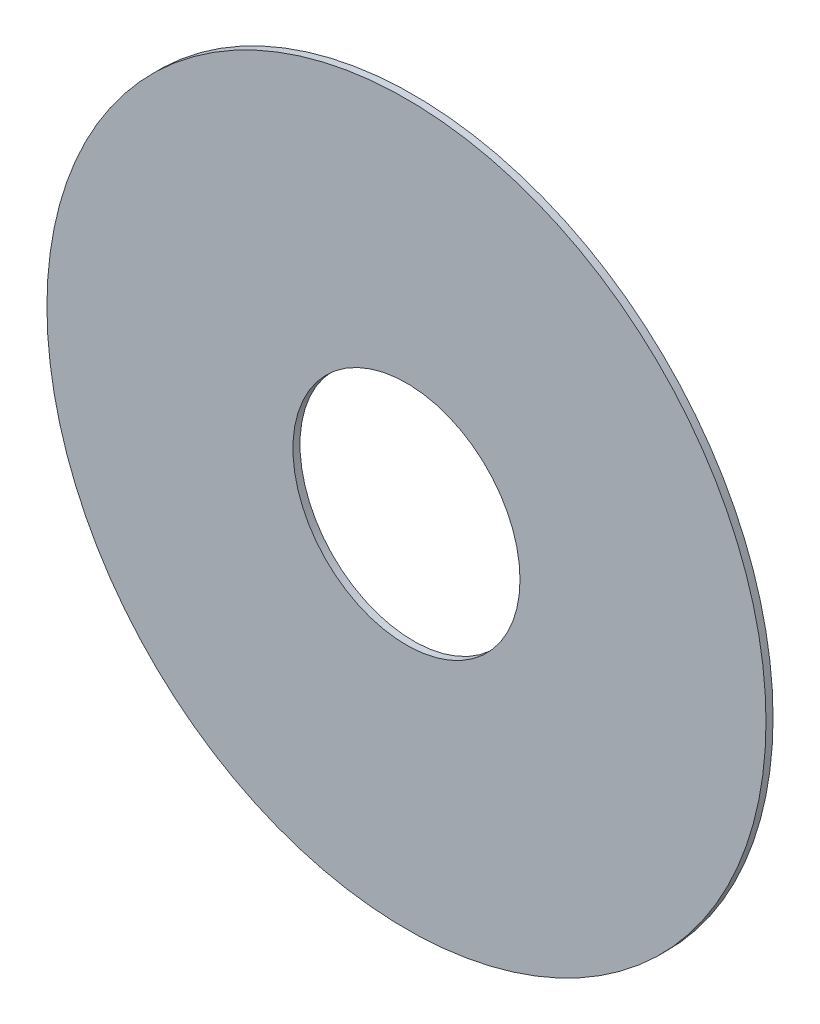
ISO-10303-21;
HEADER;
FILE_DESCRIPTION(('STEP AP214'),'2;1');
FILE_NAME('part.step','',(''),(''),'','','');
FILE_SCHEMA(('AUTOMOTIVE_DESIGN { 1 0 10303 214 1 1 1 1 }'));
ENDSEC;
DATA;
#1=APPLICATION_CONTEXT('core data for automotive mechanical design processes');
#2=APPLICATION_PROTOCOL_DEFINITION('international standard','automotive_design',2000,#1);
#3=PRODUCT_CONTEXT('',#1,'mechanical');
#4=PRODUCT('Part','Part','',(#3));
#5=PRODUCT_RELATED_PRODUCT_CATEGORY('part','',(#4));
#6=PRODUCT_DEFINITION_FORMATION('','',#4);
#7=PRODUCT_DEFINITION_CONTEXT('part definition',#1,'design');
#8=PRODUCT_DEFINITION('design','',#6,#7);
#9=PRODUCT_DEFINITION_SHAPE('','',#8);
#10=(LENGTH_UNIT() NAMED_UNIT(*) SI_UNIT(.MILLI.,.METRE.));
#11=(NAMED_UNIT(*) PLANE_ANGLE_UNIT() SI_UNIT($,.RADIAN.));
#12=(NAMED_UNIT(*) SI_UNIT($,.STERADIAN.) SOLID_ANGLE_UNIT());
#13=UNCERTAINTY_MEASURE_WITH_UNIT(LENGTH_MEASURE(1.E-05),#10,'distance_accuracy_value','');
#14=(GEOMETRIC_REPRESENTATION_CONTEXT(3) GLOBAL_UNCERTAINTY_ASSIGNED_CONTEXT((#13)) GLOBAL_UNIT_ASSIGNED_CONTEXT((#10,
#11,#12)) REPRESENTATION_CONTEXT('',''));
#15=CARTESIAN_POINT('',(0.,0.,0.));
#16=DIRECTION('',(0.,0.,1.));
#17=DIRECTION('',(1.,0.,0.));
#18=AXIS2_PLACEMENT_3D('',#15,#16,#17);
#19=CARTESIAN_POINT('',(0.,0.,4.7371));
#20=DIRECTION('',(0.,0.,1.));
#21=DIRECTION('',(1.,0.,0.));
#22=AXIS2_PLACEMENT_3D('',#19,#20,#21);
#23=PLANE('',#22);
#24=CARTESIAN_POINT('',(0.,0.,4.7371));
#25=DIRECTION('',(0.,0.,1.));
#26=DIRECTION('',(1.,0.,0.));
#27=AXIS2_PLACEMENT_3D('',#24,#25,#26);
#28=CIRCLE('',#27,241.3);
#29=CARTESIAN_POINT('',(241.3,0.,4.7371));
#30=VERTEX_POINT('',#29);
#31=EDGE_CURVE('E10',#30,#30,#28,.T.);
#32=ORIENTED_EDGE('',*,*,#31,.T.);
#33=EDGE_LOOP('',(#32));
#34=FACE_BOUND('',#33,.T.);
#35=CARTESIAN_POINT('',(0.,0.,4.7371));
#36=DIRECTION('',(0.,0.,1.));
#37=DIRECTION('',(1.,0.,0.));
#38=AXIS2_PLACEMENT_3D('',#35,#36,#37);
#39=CIRCLE('',#38,76.2);
#40=CARTESIAN_POINT('',(76.2,0.,4.7371));
#41=VERTEX_POINT('',#40);
#42=EDGE_CURVE('E42',#41,#41,#39,.T.);
#43=ORIENTED_EDGE('',*,*,#42,.F.);
#44=EDGE_LOOP('',(#43));
#45=FACE_BOUND('',#44,.T.);
#46=ADVANCED_FACE('F31',(#34,#45),#23,.T.);
#47=CARTESIAN_POINT('',(0.,0.,0.));
#48=DIRECTION('',(0.,0.,1.));
#49=DIRECTION('',(1.,0.,0.));
#50=AXIS2_PLACEMENT_3D('',#47,#48,#49);
#51=PLANE('',#50);
#52=CARTESIAN_POINT('',(0.,0.,0.));
#53=DIRECTION('',(0.,0.,1.));
#54=DIRECTION('',(1.,0.,0.));
#55=AXIS2_PLACEMENT_3D('',#52,#53,#54);
#56=CIRCLE('',#55,241.3);
#57=CARTESIAN_POINT('',(241.3,0.,0.));
#58=VERTEX_POINT('',#57);
#59=EDGE_CURVE('E35',#58,#58,#56,.T.);
#60=ORIENTED_EDGE('',*,*,#59,.F.);
#61=EDGE_LOOP('',(#60));
#62=FACE_BOUND('',#61,.T.);
#63=CARTESIAN_POINT('',(0.,0.,0.));
#64=DIRECTION('',(0.,0.,1.));
#65=DIRECTION('',(1.,0.,0.));
#66=AXIS2_PLACEMENT_3D('',#63,#64,#65);
#67=CIRCLE('',#66,76.2);
#68=CARTESIAN_POINT('',(76.2,0.,0.));
#69=VERTEX_POINT('',#68);
#70=EDGE_CURVE('E44',#69,#69,#67,.T.);
#71=ORIENTED_EDGE('',*,*,#70,.T.);
#72=EDGE_LOOP('',(#71));
#73=FACE_BOUND('',#72,.T.);
#74=ADVANCED_FACE('F54',(#62,#73),#51,.F.);
#75=CARTESIAN_POINT('',(0.,0.,4.7371));
#76=DIRECTION('',(0.,0.,-1.));
#77=DIRECTION('',(-1.,0.,0.));
#78=AXIS2_PLACEMENT_3D('',#75,#76,#77);
#79=CYLINDRICAL_SURFACE('',#78,241.3);
#80=ORIENTED_EDGE('',*,*,#31,.F.);
#81=EDGE_LOOP('',(#80));
#82=FACE_BOUND('',#81,.T.);
#83=ORIENTED_EDGE('',*,*,#59,.T.);
#84=EDGE_LOOP('',(#83));
#85=FACE_BOUND('',#84,.T.);
#86=ADVANCED_FACE('F33',(#82,#85),#79,.T.);
#87=CARTESIAN_POINT('',(0.,0.,4.7371));
#88=DIRECTION('',(0.,0.,-1.));
#89=DIRECTION('',(-1.,0.,0.));
#90=AXIS2_PLACEMENT_3D('',#87,#88,#89);
#91=CYLINDRICAL_SURFACE('',#90,76.2);
#92=ORIENTED_EDGE('',*,*,#42,.T.);
#93=EDGE_LOOP('',(#92));
#94=FACE_BOUND('',#93,.T.);
#95=ORIENTED_EDGE('',*,*,#70,.F.);
#96=EDGE_LOOP('',(#95));
#97=FACE_BOUND('',#96,.T.);
#98=ADVANCED_FACE('F50',(#94,#97),#91,.F.);
#99=CLOSED_SHELL('',(#46,#74,#86,#98));
#100=MANIFOLD_SOLID_BREP('B2',#99);
#101=ADVANCED_BREP_SHAPE_REPRESENTATION('',(#18,#100),#14);
#102=SHAPE_DEFINITION_REPRESENTATION(#9,#101);
ENDSEC;
END-ISO-10303-21;
